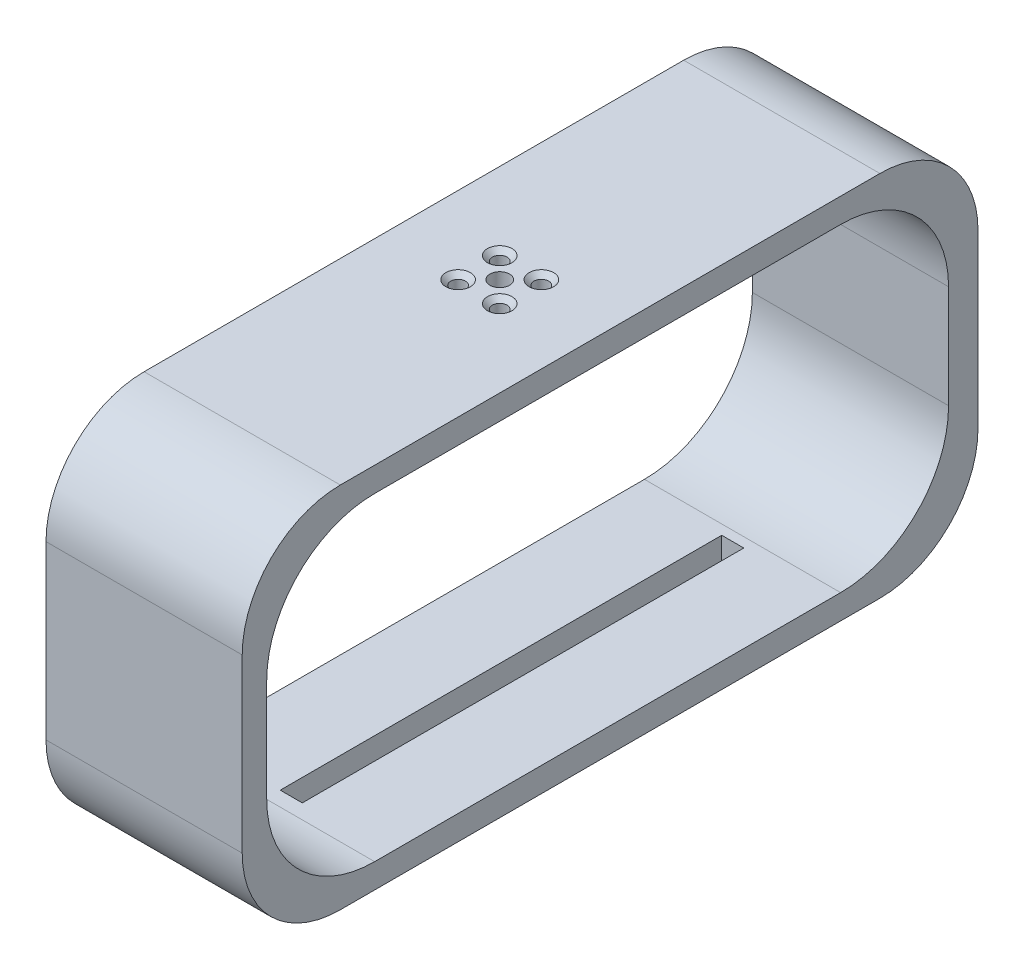
ISO-10303-21;
HEADER;
FILE_DESCRIPTION(('STEP AP214'),'2;1');
FILE_NAME('part.step','',(''),(''),'','','');
FILE_SCHEMA(('AUTOMOTIVE_DESIGN { 1 0 10303 214 1 1 1 1 }'));
ENDSEC;
DATA;
#1=APPLICATION_CONTEXT('core data for automotive mechanical design processes');
#2=APPLICATION_PROTOCOL_DEFINITION('international standard','automotive_design',2000,#1);
#3=PRODUCT_CONTEXT('',#1,'mechanical');
#4=PRODUCT('Part','Part','',(#3));
#5=PRODUCT_RELATED_PRODUCT_CATEGORY('part','',(#4));
#6=PRODUCT_DEFINITION_FORMATION('','',#4);
#7=PRODUCT_DEFINITION_CONTEXT('part definition',#1,'design');
#8=PRODUCT_DEFINITION('design','',#6,#7);
#9=PRODUCT_DEFINITION_SHAPE('','',#8);
#10=(LENGTH_UNIT() NAMED_UNIT(*) SI_UNIT(.MILLI.,.METRE.));
#11=(NAMED_UNIT(*) PLANE_ANGLE_UNIT() SI_UNIT($,.RADIAN.));
#12=(NAMED_UNIT(*) SI_UNIT($,.STERADIAN.) SOLID_ANGLE_UNIT());
#13=UNCERTAINTY_MEASURE_WITH_UNIT(LENGTH_MEASURE(1.E-05),#10,'distance_accuracy_value','');
#14=(GEOMETRIC_REPRESENTATION_CONTEXT(3) GLOBAL_UNCERTAINTY_ASSIGNED_CONTEXT((#13)) GLOBAL_UNIT_ASSIGNED_CONTEXT((#10,
#11,#12)) REPRESENTATION_CONTEXT('',''));
#15=CARTESIAN_POINT('',(0.,0.,0.));
#16=DIRECTION('',(0.,0.,1.));
#17=DIRECTION('',(1.,0.,0.));
#18=AXIS2_PLACEMENT_3D('',#15,#16,#17);
#19=CARTESIAN_POINT('',(20.,0.,0.));
#20=DIRECTION('',(1.,0.,0.));
#21=DIRECTION('',(0.,0.,-1.));
#22=AXIS2_PLACEMENT_3D('',#19,#20,#21);
#23=PLANE('',#22);
#24=DIRECTION('',(0.,-1.,0.));
#25=VECTOR('',#24,1.);
#26=CARTESIAN_POINT('',(20.,75.,0.));
#27=LINE('',#26,#25);
#28=CARTESIAN_POINT('',(20.,55.,0.));
#29=VERTEX_POINT('',#28);
#30=CARTESIAN_POINT('',(20.,20.,0.));
#31=VERTEX_POINT('',#30);
#32=EDGE_CURVE('E233',#29,#31,#27,.T.);
#33=ORIENTED_EDGE('',*,*,#32,.T.);
#34=CARTESIAN_POINT('',(20.,20.,-20.));
#35=DIRECTION('',(1.,0.,0.));
#36=DIRECTION('',(0.,0.,-1.));
#37=AXIS2_PLACEMENT_3D('',#34,#35,#36);
#38=CIRCLE('',#37,20.);
#39=CARTESIAN_POINT('',(20.,0.,-20.));
#40=VERTEX_POINT('',#39);
#41=EDGE_CURVE('E359',#31,#40,#38,.T.);
#42=ORIENTED_EDGE('',*,*,#41,.T.);
#43=DIRECTION('',(0.,0.,-1.));
#44=VECTOR('',#43,1.);
#45=CARTESIAN_POINT('',(20.,0.,0.));
#46=LINE('',#45,#44);
#47=CARTESIAN_POINT('',(20.,0.,-130.));
#48=VERTEX_POINT('',#47);
#49=EDGE_CURVE('E236',#40,#48,#46,.T.);
#50=ORIENTED_EDGE('',*,*,#49,.T.);
#51=CARTESIAN_POINT('',(20.,20.,-130.));
#52=DIRECTION('',(1.,0.,0.));
#53=DIRECTION('',(0.,0.,-1.));
#54=AXIS2_PLACEMENT_3D('',#51,#52,#53);
#55=CIRCLE('',#54,20.);
#56=CARTESIAN_POINT('',(20.,20.,-150.));
#57=VERTEX_POINT('',#56);
#58=EDGE_CURVE('E355',#48,#57,#55,.T.);
#59=ORIENTED_EDGE('',*,*,#58,.T.);
#60=DIRECTION('',(0.,1.,0.));
#61=VECTOR('',#60,1.);
#62=CARTESIAN_POINT('',(20.,0.,-150.));
#63=LINE('',#62,#61);
#64=CARTESIAN_POINT('',(20.,55.,-150.));
#65=VERTEX_POINT('',#64);
#66=EDGE_CURVE('E240',#57,#65,#63,.T.);
#67=ORIENTED_EDGE('',*,*,#66,.T.);
#68=CARTESIAN_POINT('',(20.,55.,-130.));
#69=DIRECTION('',(1.,0.,0.));
#70=DIRECTION('',(0.,0.,-1.));
#71=AXIS2_PLACEMENT_3D('',#68,#69,#70);
#72=CIRCLE('',#71,20.);
#73=CARTESIAN_POINT('',(20.,75.,-130.));
#74=VERTEX_POINT('',#73);
#75=EDGE_CURVE('E56',#65,#74,#72,.T.);
#76=ORIENTED_EDGE('',*,*,#75,.T.);
#77=DIRECTION('',(0.,0.,1.));
#78=VECTOR('',#77,1.);
#79=CARTESIAN_POINT('',(20.,75.,-150.));
#80=LINE('',#79,#78);
#81=CARTESIAN_POINT('',(20.,75.,-20.));
#82=VERTEX_POINT('',#81);
#83=EDGE_CURVE('E242',#74,#82,#80,.T.);
#84=ORIENTED_EDGE('',*,*,#83,.T.);
#85=CARTESIAN_POINT('',(20.,55.,-20.));
#86=DIRECTION('',(1.,0.,0.));
#87=DIRECTION('',(0.,0.,-1.));
#88=AXIS2_PLACEMENT_3D('',#85,#86,#87);
#89=CIRCLE('',#88,20.);
#90=EDGE_CURVE('E357',#82,#29,#89,.T.);
#91=ORIENTED_EDGE('',*,*,#90,.T.);
#92=EDGE_LOOP('',(#33,#42,#50,#59,#67,#76,#84,#91));
#93=FACE_BOUND('',#92,.T.);
#94=DIRECTION('',(0.,0.,-1.));
#95=VECTOR('',#94,1.);
#96=CARTESIAN_POINT('',(20.,5.,-144.));
#97=LINE('',#96,#95);
#98=CARTESIAN_POINT('',(20.,4.99999999999998,-27.));
#99=VERTEX_POINT('',#98);
#100=CARTESIAN_POINT('',(20.,4.99999999999999,-122.));
#101=VERTEX_POINT('',#100);
#102=EDGE_CURVE('E212',#99,#101,#97,.T.);
#103=ORIENTED_EDGE('',*,*,#102,.F.);
#104=CARTESIAN_POINT('',(20.,27.,-27.));
#105=DIRECTION('',(1.,0.,0.));
#106=DIRECTION('',(0.,0.,-1.));
#107=AXIS2_PLACEMENT_3D('',#104,#105,#106);
#108=CIRCLE('',#107,22.);
#109=CARTESIAN_POINT('',(20.,27.,-5.00000000000001));
#110=VERTEX_POINT('',#109);
#111=EDGE_CURVE('E330',#99,#110,#108,.F.);
#112=ORIENTED_EDGE('',*,*,#111,.T.);
#113=DIRECTION('',(0.,-1.,0.));
#114=VECTOR('',#113,1.);
#115=CARTESIAN_POINT('',(20.,4.99999999999998,-5.00000000000001));
#116=LINE('',#115,#114);
#117=CARTESIAN_POINT('',(20.,48.,-5.00000000000001));
#118=VERTEX_POINT('',#117);
#119=EDGE_CURVE('E209',#118,#110,#116,.T.);
#120=ORIENTED_EDGE('',*,*,#119,.F.);
#121=CARTESIAN_POINT('',(20.,48.,-27.));
#122=DIRECTION('',(1.,0.,0.));
#123=DIRECTION('',(0.,0.,-1.));
#124=AXIS2_PLACEMENT_3D('',#121,#122,#123);
#125=CIRCLE('',#124,22.);
#126=CARTESIAN_POINT('',(20.,70.,-27.));
#127=VERTEX_POINT('',#126);
#128=EDGE_CURVE('E334',#118,#127,#125,.F.);
#129=ORIENTED_EDGE('',*,*,#128,.T.);
#130=DIRECTION('',(0.,0.,1.));
#131=VECTOR('',#130,1.);
#132=CARTESIAN_POINT('',(20.,70.,-120.));
#133=LINE('',#132,#131);
#134=CARTESIAN_POINT('',(20.,70.,-122.));
#135=VERTEX_POINT('',#134);
#136=EDGE_CURVE('E219',#135,#127,#133,.T.);
#137=ORIENTED_EDGE('',*,*,#136,.F.);
#138=CARTESIAN_POINT('',(20.,48.,-122.));
#139=DIRECTION('',(1.,0.,0.));
#140=DIRECTION('',(0.,0.,-1.));
#141=AXIS2_PLACEMENT_3D('',#138,#139,#140);
#142=CIRCLE('',#141,22.);
#143=CARTESIAN_POINT('',(20.,48.,-144.));
#144=VERTEX_POINT('',#143);
#145=EDGE_CURVE('E326',#135,#144,#142,.F.);
#146=ORIENTED_EDGE('',*,*,#145,.T.);
#147=DIRECTION('',(0.,1.,0.));
#148=VECTOR('',#147,1.);
#149=CARTESIAN_POINT('',(20.,70.,-144.));
#150=LINE('',#149,#148);
#151=CARTESIAN_POINT('',(20.,27.,-144.));
#152=VERTEX_POINT('',#151);
#153=EDGE_CURVE('E216',#152,#144,#150,.T.);
#154=ORIENTED_EDGE('',*,*,#153,.F.);
#155=CARTESIAN_POINT('',(20.,27.,-122.));
#156=DIRECTION('',(1.,0.,0.));
#157=DIRECTION('',(0.,0.,-1.));
#158=AXIS2_PLACEMENT_3D('',#155,#156,#157);
#159=CIRCLE('',#158,22.);
#160=EDGE_CURVE('E322',#152,#101,#159,.F.);
#161=ORIENTED_EDGE('',*,*,#160,.T.);
#162=EDGE_LOOP('',(#103,#112,#120,#129,#137,#146,#154,#161));
#163=FACE_BOUND('',#162,.T.);
#164=ADVANCED_FACE('F34',(#93,#163),#23,.T.);
#165=CARTESIAN_POINT('',(-20.,0.,0.));
#166=DIRECTION('',(1.,0.,0.));
#167=DIRECTION('',(0.,0.,-1.));
#168=AXIS2_PLACEMENT_3D('',#165,#166,#167);
#169=PLANE('',#168);
#170=DIRECTION('',(0.,0.,-1.));
#171=VECTOR('',#170,1.);
#172=CARTESIAN_POINT('',(-20.,0.,0.));
#173=LINE('',#172,#171);
#174=CARTESIAN_POINT('',(-20.,0.,-20.));
#175=VERTEX_POINT('',#174);
#176=CARTESIAN_POINT('',(-20.,0.,-130.));
#177=VERTEX_POINT('',#176);
#178=EDGE_CURVE('E247',#175,#177,#173,.T.);
#179=ORIENTED_EDGE('',*,*,#178,.F.);
#180=CARTESIAN_POINT('',(-20.,20.,-20.));
#181=DIRECTION('',(1.,0.,0.));
#182=DIRECTION('',(0.,0.,-1.));
#183=AXIS2_PLACEMENT_3D('',#180,#181,#182);
#184=CIRCLE('',#183,20.);
#185=CARTESIAN_POINT('',(-20.,20.,0.));
#186=VERTEX_POINT('',#185);
#187=EDGE_CURVE('E347',#175,#186,#184,.F.);
#188=ORIENTED_EDGE('',*,*,#187,.T.);
#189=DIRECTION('',(0.,-1.,0.));
#190=VECTOR('',#189,1.);
#191=CARTESIAN_POINT('',(-20.,75.,0.));
#192=LINE('',#191,#190);
#193=CARTESIAN_POINT('',(-20.,55.,0.));
#194=VERTEX_POINT('',#193);
#195=EDGE_CURVE('E222',#194,#186,#192,.T.);
#196=ORIENTED_EDGE('',*,*,#195,.F.);
#197=CARTESIAN_POINT('',(-20.,55.,-20.));
#198=DIRECTION('',(1.,0.,0.));
#199=DIRECTION('',(0.,0.,-1.));
#200=AXIS2_PLACEMENT_3D('',#197,#198,#199);
#201=CIRCLE('',#200,20.);
#202=CARTESIAN_POINT('',(-20.,75.,-20.));
#203=VERTEX_POINT('',#202);
#204=EDGE_CURVE('E345',#194,#203,#201,.F.);
#205=ORIENTED_EDGE('',*,*,#204,.T.);
#206=DIRECTION('',(0.,0.,1.));
#207=VECTOR('',#206,1.);
#208=CARTESIAN_POINT('',(-20.,75.,-120.));
#209=LINE('',#208,#207);
#210=CARTESIAN_POINT('',(-20.,75.,-130.));
#211=VERTEX_POINT('',#210);
#212=EDGE_CURVE('E237',#211,#203,#209,.T.);
#213=ORIENTED_EDGE('',*,*,#212,.F.);
#214=CARTESIAN_POINT('',(-20.,55.,-130.));
#215=DIRECTION('',(1.,0.,0.));
#216=DIRECTION('',(0.,0.,-1.));
#217=AXIS2_PLACEMENT_3D('',#214,#215,#216);
#218=CIRCLE('',#217,20.);
#219=CARTESIAN_POINT('',(-20.,55.,-150.));
#220=VERTEX_POINT('',#219);
#221=EDGE_CURVE('E341',#211,#220,#218,.F.);
#222=ORIENTED_EDGE('',*,*,#221,.T.);
#223=DIRECTION('',(0.,1.,0.));
#224=VECTOR('',#223,1.);
#225=CARTESIAN_POINT('',(-20.,3.00000000000002,-150.));
#226=LINE('',#225,#224);
#227=CARTESIAN_POINT('',(-20.,20.,-150.));
#228=VERTEX_POINT('',#227);
#229=EDGE_CURVE('E250',#228,#220,#226,.T.);
#230=ORIENTED_EDGE('',*,*,#229,.F.);
#231=CARTESIAN_POINT('',(-20.,20.,-130.));
#232=DIRECTION('',(1.,0.,0.));
#233=DIRECTION('',(0.,0.,-1.));
#234=AXIS2_PLACEMENT_3D('',#231,#232,#233);
#235=CIRCLE('',#234,20.);
#236=EDGE_CURVE('E343',#228,#177,#235,.F.);
#237=ORIENTED_EDGE('',*,*,#236,.T.);
#238=EDGE_LOOP('',(#179,#188,#196,#205,#213,#222,#230,#237));
#239=FACE_BOUND('',#238,.T.);
#240=DIRECTION('',(0.,0.,1.));
#241=VECTOR('',#240,1.);
#242=CARTESIAN_POINT('',(-20.,70.,-5.00000000000001));
#243=LINE('',#242,#241);
#244=CARTESIAN_POINT('',(-20.,70.,-122.));
#245=VERTEX_POINT('',#244);
#246=CARTESIAN_POINT('',(-20.,70.,-27.));
#247=VERTEX_POINT('',#246);
#248=EDGE_CURVE('E213',#245,#247,#243,.T.);
#249=ORIENTED_EDGE('',*,*,#248,.T.);
#250=CARTESIAN_POINT('',(-20.,48.,-27.));
#251=DIRECTION('',(1.,0.,0.));
#252=DIRECTION('',(0.,0.,-1.));
#253=AXIS2_PLACEMENT_3D('',#250,#251,#252);
#254=CIRCLE('',#253,22.);
#255=CARTESIAN_POINT('',(-20.,48.,-5.00000000000001));
#256=VERTEX_POINT('',#255);
#257=EDGE_CURVE('E332',#247,#256,#254,.T.);
#258=ORIENTED_EDGE('',*,*,#257,.T.);
#259=DIRECTION('',(0.,-1.,0.));
#260=VECTOR('',#259,1.);
#261=CARTESIAN_POINT('',(-20.,4.99999999999998,-5.00000000000001));
#262=LINE('',#261,#260);
#263=CARTESIAN_POINT('',(-20.,27.,-5.00000000000001));
#264=VERTEX_POINT('',#263);
#265=EDGE_CURVE('E206',#256,#264,#262,.T.);
#266=ORIENTED_EDGE('',*,*,#265,.T.);
#267=CARTESIAN_POINT('',(-20.,27.,-27.));
#268=DIRECTION('',(1.,0.,0.));
#269=DIRECTION('',(0.,0.,-1.));
#270=AXIS2_PLACEMENT_3D('',#267,#268,#269);
#271=CIRCLE('',#270,22.);
#272=CARTESIAN_POINT('',(-20.,4.99999999999998,-27.));
#273=VERTEX_POINT('',#272);
#274=EDGE_CURVE('E328',#264,#273,#271,.T.);
#275=ORIENTED_EDGE('',*,*,#274,.T.);
#276=DIRECTION('',(0.,0.,-1.));
#277=VECTOR('',#276,1.);
#278=CARTESIAN_POINT('',(-20.,5.,-144.));
#279=LINE('',#278,#277);
#280=CARTESIAN_POINT('',(-20.,4.99999999999999,-122.));
#281=VERTEX_POINT('',#280);
#282=EDGE_CURVE('E225',#273,#281,#279,.T.);
#283=ORIENTED_EDGE('',*,*,#282,.T.);
#284=CARTESIAN_POINT('',(-20.,27.,-122.));
#285=DIRECTION('',(1.,0.,0.));
#286=DIRECTION('',(0.,0.,-1.));
#287=AXIS2_PLACEMENT_3D('',#284,#285,#286);
#288=CIRCLE('',#287,22.);
#289=CARTESIAN_POINT('',(-20.,27.,-144.));
#290=VERTEX_POINT('',#289);
#291=EDGE_CURVE('E320',#281,#290,#288,.T.);
#292=ORIENTED_EDGE('',*,*,#291,.T.);
#293=DIRECTION('',(0.,1.,0.));
#294=VECTOR('',#293,1.);
#295=CARTESIAN_POINT('',(-20.,70.,-144.));
#296=LINE('',#295,#294);
#297=CARTESIAN_POINT('',(-20.,48.,-144.));
#298=VERTEX_POINT('',#297);
#299=EDGE_CURVE('E228',#290,#298,#296,.T.);
#300=ORIENTED_EDGE('',*,*,#299,.T.);
#301=CARTESIAN_POINT('',(-20.,48.,-122.));
#302=DIRECTION('',(1.,0.,0.));
#303=DIRECTION('',(0.,0.,-1.));
#304=AXIS2_PLACEMENT_3D('',#301,#302,#303);
#305=CIRCLE('',#304,22.);
#306=EDGE_CURVE('E324',#298,#245,#305,.T.);
#307=ORIENTED_EDGE('',*,*,#306,.T.);
#308=EDGE_LOOP('',(#249,#258,#266,#275,#283,#292,#300,#307));
#309=FACE_BOUND('',#308,.T.);
#310=ADVANCED_FACE('F378',(#239,#309),#169,.F.);
#311=CARTESIAN_POINT('',(20.,75.,0.));
#312=DIRECTION('',(0.,0.,-1.));
#313=DIRECTION('',(-1.,0.,0.));
#314=AXIS2_PLACEMENT_3D('',#311,#312,#313);
#315=PLANE('',#314);
#316=ORIENTED_EDGE('',*,*,#195,.T.);
#317=DIRECTION('',(-1.,0.,0.));
#318=VECTOR('',#317,1.);
#319=CARTESIAN_POINT('',(20.,20.,0.));
#320=LINE('',#319,#318);
#321=EDGE_CURVE('E352',#186,#31,#320,.F.);
#322=ORIENTED_EDGE('',*,*,#321,.T.);
#323=ORIENTED_EDGE('',*,*,#32,.F.);
#324=DIRECTION('',(-1.,0.,0.));
#325=VECTOR('',#324,1.);
#326=CARTESIAN_POINT('',(20.,55.,0.));
#327=LINE('',#326,#325);
#328=EDGE_CURVE('E349',#29,#194,#327,.T.);
#329=ORIENTED_EDGE('',*,*,#328,.T.);
#330=EDGE_LOOP('',(#316,#322,#323,#329));
#331=FACE_BOUND('',#330,.T.);
#332=ADVANCED_FACE('F387',(#331),#315,.F.);
#333=CARTESIAN_POINT('',(20.,0.,0.));
#334=DIRECTION('',(0.,1.,0.));
#335=DIRECTION('',(0.,0.,1.));
#336=AXIS2_PLACEMENT_3D('',#333,#334,#335);
#337=PLANE('',#336);
#338=DIRECTION('',(0.,0.,-1.));
#339=VECTOR('',#338,1.);
#340=CARTESIAN_POINT('',(-2.25,0.,-120.));
#341=LINE('',#340,#339);
#342=CARTESIAN_POINT('',(-2.25,0.,-30.));
#343=VERTEX_POINT('',#342);
#344=CARTESIAN_POINT('',(-2.25,0.,-120.));
#345=VERTEX_POINT('',#344);
#346=EDGE_CURVE('E189',#343,#345,#341,.T.);
#347=ORIENTED_EDGE('',*,*,#346,.F.);
#348=DIRECTION('',(-1.,0.,0.));
#349=VECTOR('',#348,1.);
#350=CARTESIAN_POINT('',(-2.25,0.,-30.));
#351=LINE('',#350,#349);
#352=CARTESIAN_POINT('',(2.25,0.,-30.));
#353=VERTEX_POINT('',#352);
#354=EDGE_CURVE('E194',#353,#343,#351,.T.);
#355=ORIENTED_EDGE('',*,*,#354,.F.);
#356=DIRECTION('',(0.,0.,1.));
#357=VECTOR('',#356,1.);
#358=CARTESIAN_POINT('',(2.25,0.,-30.));
#359=LINE('',#358,#357);
#360=CARTESIAN_POINT('',(2.25000000000001,0.,-120.));
#361=VERTEX_POINT('',#360);
#362=EDGE_CURVE('E199',#361,#353,#359,.T.);
#363=ORIENTED_EDGE('',*,*,#362,.F.);
#364=DIRECTION('',(1.,0.,0.));
#365=VECTOR('',#364,1.);
#366=CARTESIAN_POINT('',(2.25000000000001,0.,-120.));
#367=LINE('',#366,#365);
#368=EDGE_CURVE('E178',#345,#361,#367,.T.);
#369=ORIENTED_EDGE('',*,*,#368,.F.);
#370=EDGE_LOOP('',(#347,#355,#363,#369));
#371=FACE_BOUND('',#370,.T.);
#372=ORIENTED_EDGE('',*,*,#49,.F.);
#373=DIRECTION('',(-1.,0.,0.));
#374=VECTOR('',#373,1.);
#375=CARTESIAN_POINT('',(20.,0.,-20.));
#376=LINE('',#375,#374);
#377=EDGE_CURVE('E338',#40,#175,#376,.T.);
#378=ORIENTED_EDGE('',*,*,#377,.T.);
#379=ORIENTED_EDGE('',*,*,#178,.T.);
#380=DIRECTION('',(-1.,0.,0.));
#381=VECTOR('',#380,1.);
#382=CARTESIAN_POINT('',(20.,0.,-130.));
#383=LINE('',#382,#381);
#384=EDGE_CURVE('E336',#177,#48,#383,.F.);
#385=ORIENTED_EDGE('',*,*,#384,.T.);
#386=EDGE_LOOP('',(#372,#378,#379,#385));
#387=FACE_BOUND('',#386,.T.);
#388=ADVANCED_FACE('F196',(#371,#387),#337,.F.);
#389=CARTESIAN_POINT('',(20.,3.00000000000002,-150.));
#390=DIRECTION('',(0.,0.,1.));
#391=DIRECTION('',(1.,0.,0.));
#392=AXIS2_PLACEMENT_3D('',#389,#390,#391);
#393=PLANE('',#392);
#394=ORIENTED_EDGE('',*,*,#66,.F.);
#395=DIRECTION('',(-1.,0.,0.));
#396=VECTOR('',#395,1.);
#397=CARTESIAN_POINT('',(20.,20.,-150.));
#398=LINE('',#397,#396);
#399=EDGE_CURVE('E11',#57,#228,#398,.T.);
#400=ORIENTED_EDGE('',*,*,#399,.T.);
#401=ORIENTED_EDGE('',*,*,#229,.T.);
#402=DIRECTION('',(-1.,0.,0.));
#403=VECTOR('',#402,1.);
#404=CARTESIAN_POINT('',(20.,55.,-150.));
#405=LINE('',#404,#403);
#406=EDGE_CURVE('E42',#220,#65,#405,.F.);
#407=ORIENTED_EDGE('',*,*,#406,.T.);
#408=EDGE_LOOP('',(#394,#400,#401,#407));
#409=FACE_BOUND('',#408,.T.);
#410=ADVANCED_FACE('F367',(#409),#393,.F.);
#411=CARTESIAN_POINT('',(20.,75.,-120.));
#412=DIRECTION('',(0.,-1.,0.));
#413=DIRECTION('',(0.,0.,-1.));
#414=AXIS2_PLACEMENT_3D('',#411,#412,#413);
#415=PLANE('',#414);
#416=CARTESIAN_POINT('',(4.24264068711923,75.,-68.2573593128807));
#417=DIRECTION('',(0.,-1.,0.));
#418=DIRECTION('',(0.,0.,-1.));
#419=AXIS2_PLACEMENT_3D('',#416,#417,#418);
#420=CIRCLE('',#419,2.5);
#421=CARTESIAN_POINT('',(4.24264068711923,75.,-70.7573593128807));
#422=VERTEX_POINT('',#421);
#423=EDGE_CURVE('E288',#422,#422,#420,.T.);
#424=ORIENTED_EDGE('',*,*,#423,.T.);
#425=EDGE_LOOP('',(#424));
#426=FACE_BOUND('',#425,.T.);
#427=CARTESIAN_POINT('',(4.24264068711929,75.,-76.7426406871193));
#428=DIRECTION('',(0.,-1.,0.));
#429=DIRECTION('',(0.,0.,-1.));
#430=AXIS2_PLACEMENT_3D('',#427,#428,#429);
#431=CIRCLE('',#430,2.50000000000002);
#432=CARTESIAN_POINT('',(4.24264068711929,75.,-79.2426406871193));
#433=VERTEX_POINT('',#432);
#434=EDGE_CURVE('E285',#433,#433,#431,.T.);
#435=ORIENTED_EDGE('',*,*,#434,.T.);
#436=EDGE_LOOP('',(#435));
#437=FACE_BOUND('',#436,.T.);
#438=CARTESIAN_POINT('',(-4.24264068711935,75.,-76.7426406871193));
#439=DIRECTION('',(0.,-1.,0.));
#440=DIRECTION('',(0.,0.,-1.));
#441=AXIS2_PLACEMENT_3D('',#438,#439,#440);
#442=CIRCLE('',#441,2.49999999999995);
#443=CARTESIAN_POINT('',(-4.24264068711935,75.,-79.2426406871192));
#444=VERTEX_POINT('',#443);
#445=EDGE_CURVE('E282',#444,#444,#442,.T.);
#446=ORIENTED_EDGE('',*,*,#445,.T.);
#447=EDGE_LOOP('',(#446));
#448=FACE_BOUND('',#447,.T.);
#449=CARTESIAN_POINT('',(-4.24264068711935,75.,-68.2573593128807));
#450=DIRECTION('',(0.,-1.,0.));
#451=DIRECTION('',(0.,0.,-1.));
#452=AXIS2_PLACEMENT_3D('',#449,#450,#451);
#453=CIRCLE('',#452,2.50000000000015);
#454=CARTESIAN_POINT('',(-4.24264068711935,75.,-70.7573593128809));
#455=VERTEX_POINT('',#454);
#456=EDGE_CURVE('E279',#455,#455,#453,.T.);
#457=ORIENTED_EDGE('',*,*,#456,.T.);
#458=EDGE_LOOP('',(#457));
#459=FACE_BOUND('',#458,.T.);
#460=CARTESIAN_POINT('',(0.,75.,-72.5));
#461=DIRECTION('',(0.,1.,0.));
#462=DIRECTION('',(0.,0.,1.));
#463=AXIS2_PLACEMENT_3D('',#460,#461,#462);
#464=CIRCLE('',#463,2.);
#465=CARTESIAN_POINT('',(0.,75.,-70.5));
#466=VERTEX_POINT('',#465);
#467=EDGE_CURVE('E276',#466,#466,#464,.T.);
#468=ORIENTED_EDGE('',*,*,#467,.F.);
#469=EDGE_LOOP('',(#468));
#470=FACE_BOUND('',#469,.T.);
#471=ORIENTED_EDGE('',*,*,#212,.T.);
#472=DIRECTION('',(-1.,0.,0.));
#473=VECTOR('',#472,1.);
#474=CARTESIAN_POINT('',(20.,75.,-20.));
#475=LINE('',#474,#473);
#476=EDGE_CURVE('E49',#203,#82,#475,.F.);
#477=ORIENTED_EDGE('',*,*,#476,.T.);
#478=ORIENTED_EDGE('',*,*,#83,.F.);
#479=DIRECTION('',(-1.,0.,0.));
#480=VECTOR('',#479,1.);
#481=CARTESIAN_POINT('',(20.,75.,-130.));
#482=LINE('',#481,#480);
#483=EDGE_CURVE('E361',#74,#211,#482,.T.);
#484=ORIENTED_EDGE('',*,*,#483,.T.);
#485=EDGE_LOOP('',(#471,#477,#478,#484));
#486=FACE_BOUND('',#485,.T.);
#487=ADVANCED_FACE('F375',(#426,#437,#448,#459,#470,#486),#415,.F.);
#488=CARTESIAN_POINT('',(20.,4.99999999999998,-5.00000000000001));
#489=DIRECTION('',(0.,0.,-1.));
#490=DIRECTION('',(0.,1.,0.));
#491=AXIS2_PLACEMENT_3D('',#488,#489,#490);
#492=PLANE('',#491);
#493=ORIENTED_EDGE('',*,*,#119,.T.);
#494=DIRECTION('',(-1.,0.,0.));
#495=VECTOR('',#494,1.);
#496=CARTESIAN_POINT('',(-20.,27.,-5.00000000000001));
#497=LINE('',#496,#495);
#498=EDGE_CURVE('E317',#110,#264,#497,.T.);
#499=ORIENTED_EDGE('',*,*,#498,.T.);
#500=ORIENTED_EDGE('',*,*,#265,.F.);
#501=DIRECTION('',(-1.,0.,0.));
#502=VECTOR('',#501,1.);
#503=CARTESIAN_POINT('',(20.,48.,-5.00000000000001));
#504=LINE('',#503,#502);
#505=EDGE_CURVE('E315',#256,#118,#504,.F.);
#506=ORIENTED_EDGE('',*,*,#505,.T.);
#507=EDGE_LOOP('',(#493,#499,#500,#506));
#508=FACE_BOUND('',#507,.T.);
#509=ADVANCED_FACE('F410',(#508),#492,.T.);
#510=CARTESIAN_POINT('',(20.,5.,-144.));
#511=DIRECTION('',(0.,1.,0.));
#512=DIRECTION('',(0.,0.,1.));
#513=AXIS2_PLACEMENT_3D('',#510,#511,#512);
#514=PLANE('',#513);
#515=DIRECTION('',(1.,0.,0.));
#516=VECTOR('',#515,1.);
#517=CARTESIAN_POINT('',(20.,4.99999999999998,-30.));
#518=LINE('',#517,#516);
#519=CARTESIAN_POINT('',(-2.25,4.99999999999999,-30.));
#520=VERTEX_POINT('',#519);
#521=CARTESIAN_POINT('',(2.25,4.99999999999999,-30.));
#522=VERTEX_POINT('',#521);
#523=EDGE_CURVE('E258',#520,#522,#518,.T.);
#524=ORIENTED_EDGE('',*,*,#523,.F.);
#525=DIRECTION('',(0.,0.,1.));
#526=VECTOR('',#525,1.);
#527=CARTESIAN_POINT('',(-2.25,5.,-144.));
#528=LINE('',#527,#526);
#529=CARTESIAN_POINT('',(-2.25,4.99999999999999,-120.));
#530=VERTEX_POINT('',#529);
#531=EDGE_CURVE('E244',#530,#520,#528,.T.);
#532=ORIENTED_EDGE('',*,*,#531,.F.);
#533=DIRECTION('',(-1.,0.,0.));
#534=VECTOR('',#533,1.);
#535=CARTESIAN_POINT('',(20.,4.99999999999999,-120.));
#536=LINE('',#535,#534);
#537=CARTESIAN_POINT('',(2.25000000000001,4.99999999999999,-120.));
#538=VERTEX_POINT('',#537);
#539=EDGE_CURVE('E181',#538,#530,#536,.T.);
#540=ORIENTED_EDGE('',*,*,#539,.F.);
#541=DIRECTION('',(0.,0.,-1.));
#542=VECTOR('',#541,1.);
#543=CARTESIAN_POINT('',(2.25000000000002,5.,-144.));
#544=LINE('',#543,#542);
#545=EDGE_CURVE('E256',#522,#538,#544,.T.);
#546=ORIENTED_EDGE('',*,*,#545,.F.);
#547=EDGE_LOOP('',(#524,#532,#540,#546));
#548=FACE_BOUND('',#547,.T.);
#549=ORIENTED_EDGE('',*,*,#102,.T.);
#550=DIRECTION('',(-1.,0.,0.));
#551=VECTOR('',#550,1.);
#552=CARTESIAN_POINT('',(-20.,4.99999999999999,-122.));
#553=LINE('',#552,#551);
#554=EDGE_CURVE('E302',#101,#281,#553,.T.);
#555=ORIENTED_EDGE('',*,*,#554,.T.);
#556=ORIENTED_EDGE('',*,*,#282,.F.);
#557=DIRECTION('',(-1.,0.,0.));
#558=VECTOR('',#557,1.);
#559=CARTESIAN_POINT('',(20.,4.99999999999998,-27.));
#560=LINE('',#559,#558);
#561=EDGE_CURVE('E300',#273,#99,#560,.F.);
#562=ORIENTED_EDGE('',*,*,#561,.T.);
#563=EDGE_LOOP('',(#549,#555,#556,#562));
#564=FACE_BOUND('',#563,.T.);
#565=ADVANCED_FACE('F616',(#548,#564),#514,.T.);
#566=CARTESIAN_POINT('',(20.,70.,-144.));
#567=DIRECTION('',(0.,0.,1.));
#568=DIRECTION('',(1.,0.,0.));
#569=AXIS2_PLACEMENT_3D('',#566,#567,#568);
#570=PLANE('',#569);
#571=ORIENTED_EDGE('',*,*,#299,.F.);
#572=DIRECTION('',(-1.,0.,0.));
#573=VECTOR('',#572,1.);
#574=CARTESIAN_POINT('',(20.,27.,-144.));
#575=LINE('',#574,#573);
#576=EDGE_CURVE('E308',#290,#152,#575,.F.);
#577=ORIENTED_EDGE('',*,*,#576,.T.);
#578=ORIENTED_EDGE('',*,*,#153,.T.);
#579=DIRECTION('',(-1.,0.,0.));
#580=VECTOR('',#579,1.);
#581=CARTESIAN_POINT('',(-20.,48.,-144.));
#582=LINE('',#581,#580);
#583=EDGE_CURVE('E305',#144,#298,#582,.T.);
#584=ORIENTED_EDGE('',*,*,#583,.T.);
#585=EDGE_LOOP('',(#571,#577,#578,#584));
#586=FACE_BOUND('',#585,.T.);
#587=ADVANCED_FACE('F604',(#586),#570,.T.);
#588=CARTESIAN_POINT('',(20.,70.,-5.00000000000001));
#589=DIRECTION('',(0.,-1.,0.));
#590=DIRECTION('',(0.,0.,-1.));
#591=AXIS2_PLACEMENT_3D('',#588,#589,#590);
#592=PLANE('',#591);
#593=CARTESIAN_POINT('',(0.,70.,-72.5));
#594=DIRECTION('',(0.,-1.,0.));
#595=DIRECTION('',(0.,0.,-1.));
#596=AXIS2_PLACEMENT_3D('',#593,#594,#595);
#597=CIRCLE('',#596,2.);
#598=CARTESIAN_POINT('',(0.,70.,-74.5));
#599=VERTEX_POINT('',#598);
#600=EDGE_CURVE('E273',#599,#599,#597,.T.);
#601=ORIENTED_EDGE('',*,*,#600,.F.);
#602=EDGE_LOOP('',(#601));
#603=FACE_BOUND('',#602,.T.);
#604=CARTESIAN_POINT('',(-4.24264068711935,70.,-68.2573593128807));
#605=DIRECTION('',(0.,-1.,0.));
#606=DIRECTION('',(0.,0.,-1.));
#607=AXIS2_PLACEMENT_3D('',#604,#605,#606);
#608=CIRCLE('',#607,1.50000000000019);
#609=CARTESIAN_POINT('',(-4.24264068711935,70.,-69.7573593128809));
#610=VERTEX_POINT('',#609);
#611=EDGE_CURVE('E270',#610,#610,#608,.T.);
#612=ORIENTED_EDGE('',*,*,#611,.F.);
#613=EDGE_LOOP('',(#612));
#614=FACE_BOUND('',#613,.T.);
#615=CARTESIAN_POINT('',(4.24264068711923,70.,-68.2573593128807));
#616=DIRECTION('',(0.,-1.,0.));
#617=DIRECTION('',(0.,0.,-1.));
#618=AXIS2_PLACEMENT_3D('',#615,#616,#617);
#619=CIRCLE('',#618,1.5);
#620=CARTESIAN_POINT('',(4.24264068711923,70.,-69.7573593128807));
#621=VERTEX_POINT('',#620);
#622=EDGE_CURVE('E267',#621,#621,#619,.T.);
#623=ORIENTED_EDGE('',*,*,#622,.F.);
#624=EDGE_LOOP('',(#623));
#625=FACE_BOUND('',#624,.T.);
#626=CARTESIAN_POINT('',(4.24264068711929,70.,-76.7426406871193));
#627=DIRECTION('',(0.,-1.,0.));
#628=DIRECTION('',(0.,0.,-1.));
#629=AXIS2_PLACEMENT_3D('',#626,#627,#628);
#630=CIRCLE('',#629,1.50000000000007);
#631=CARTESIAN_POINT('',(4.24264068711929,70.,-78.2426406871194));
#632=VERTEX_POINT('',#631);
#633=EDGE_CURVE('E264',#632,#632,#630,.T.);
#634=ORIENTED_EDGE('',*,*,#633,.F.);
#635=EDGE_LOOP('',(#634));
#636=FACE_BOUND('',#635,.T.);
#637=CARTESIAN_POINT('',(-4.24264068711935,70.,-76.7426406871193));
#638=DIRECTION('',(0.,-1.,0.));
#639=DIRECTION('',(0.,0.,-1.));
#640=AXIS2_PLACEMENT_3D('',#637,#638,#639);
#641=CIRCLE('',#640,1.49999999999999);
#642=CARTESIAN_POINT('',(-4.24264068711935,70.,-78.2426406871193));
#643=VERTEX_POINT('',#642);
#644=EDGE_CURVE('E261',#643,#643,#641,.T.);
#645=ORIENTED_EDGE('',*,*,#644,.F.);
#646=EDGE_LOOP('',(#645));
#647=FACE_BOUND('',#646,.T.);
#648=ORIENTED_EDGE('',*,*,#248,.F.);
#649=DIRECTION('',(-1.,0.,0.));
#650=VECTOR('',#649,1.);
#651=CARTESIAN_POINT('',(20.,70.,-122.));
#652=LINE('',#651,#650);
#653=EDGE_CURVE('E313',#245,#135,#652,.F.);
#654=ORIENTED_EDGE('',*,*,#653,.T.);
#655=ORIENTED_EDGE('',*,*,#136,.T.);
#656=DIRECTION('',(-1.,0.,0.));
#657=VECTOR('',#656,1.);
#658=CARTESIAN_POINT('',(-20.,70.,-27.));
#659=LINE('',#658,#657);
#660=EDGE_CURVE('E310',#127,#247,#659,.T.);
#661=ORIENTED_EDGE('',*,*,#660,.T.);
#662=EDGE_LOOP('',(#648,#654,#655,#661));
#663=FACE_BOUND('',#662,.T.);
#664=ADVANCED_FACE('F596',(#603,#614,#625,#636,#647,#663),#592,.T.);
#665=CARTESIAN_POINT('',(-2.25,10.,-30.));
#666=DIRECTION('',(0.,0.,1.));
#667=DIRECTION('',(1.,0.,0.));
#668=AXIS2_PLACEMENT_3D('',#665,#666,#667);
#669=PLANE('',#668);
#670=ORIENTED_EDGE('',*,*,#523,.T.);
#671=DIRECTION('',(0.,-1.,0.));
#672=VECTOR('',#671,1.);
#673=CARTESIAN_POINT('',(2.25,10.,-30.));
#674=LINE('',#673,#672);
#675=EDGE_CURVE('E204',#522,#353,#674,.T.);
#676=ORIENTED_EDGE('',*,*,#675,.T.);
#677=ORIENTED_EDGE('',*,*,#354,.T.);
#678=DIRECTION('',(0.,-1.,0.));
#679=VECTOR('',#678,1.);
#680=CARTESIAN_POINT('',(-2.25,10.,-30.));
#681=LINE('',#680,#679);
#682=EDGE_CURVE('E185',#520,#343,#681,.T.);
#683=ORIENTED_EDGE('',*,*,#682,.F.);
#684=EDGE_LOOP('',(#670,#676,#677,#683));
#685=FACE_BOUND('',#684,.T.);
#686=ADVANCED_FACE('F587',(#685),#669,.F.);
#687=CARTESIAN_POINT('',(2.25,10.,-30.));
#688=DIRECTION('',(1.,0.,0.));
#689=DIRECTION('',(0.,0.,-1.));
#690=AXIS2_PLACEMENT_3D('',#687,#688,#689);
#691=PLANE('',#690);
#692=ORIENTED_EDGE('',*,*,#545,.T.);
#693=DIRECTION('',(0.,-1.,0.));
#694=VECTOR('',#693,1.);
#695=CARTESIAN_POINT('',(2.25000000000001,10.,-120.));
#696=LINE('',#695,#694);
#697=EDGE_CURVE('E184',#538,#361,#696,.T.);
#698=ORIENTED_EDGE('',*,*,#697,.T.);
#699=ORIENTED_EDGE('',*,*,#362,.T.);
#700=ORIENTED_EDGE('',*,*,#675,.F.);
#701=EDGE_LOOP('',(#692,#698,#699,#700));
#702=FACE_BOUND('',#701,.T.);
#703=ADVANCED_FACE('F579',(#702),#691,.F.);
#704=CARTESIAN_POINT('',(2.25000000000001,10.,-120.));
#705=DIRECTION('',(0.,0.,-1.));
#706=DIRECTION('',(-1.,0.,0.));
#707=AXIS2_PLACEMENT_3D('',#704,#705,#706);
#708=PLANE('',#707);
#709=ORIENTED_EDGE('',*,*,#539,.T.);
#710=DIRECTION('',(0.,-1.,0.));
#711=VECTOR('',#710,1.);
#712=CARTESIAN_POINT('',(-2.25,10.,-120.));
#713=LINE('',#712,#711);
#714=EDGE_CURVE('E173',#530,#345,#713,.T.);
#715=ORIENTED_EDGE('',*,*,#714,.T.);
#716=ORIENTED_EDGE('',*,*,#368,.T.);
#717=ORIENTED_EDGE('',*,*,#697,.F.);
#718=EDGE_LOOP('',(#709,#715,#716,#717));
#719=FACE_BOUND('',#718,.T.);
#720=ADVANCED_FACE('F175',(#719),#708,.F.);
#721=CARTESIAN_POINT('',(-2.25,10.,-120.));
#722=DIRECTION('',(-1.,0.,0.));
#723=DIRECTION('',(0.,0.,1.));
#724=AXIS2_PLACEMENT_3D('',#721,#722,#723);
#725=PLANE('',#724);
#726=ORIENTED_EDGE('',*,*,#531,.T.);
#727=ORIENTED_EDGE('',*,*,#682,.T.);
#728=ORIENTED_EDGE('',*,*,#346,.T.);
#729=ORIENTED_EDGE('',*,*,#714,.F.);
#730=EDGE_LOOP('',(#726,#727,#728,#729));
#731=FACE_BOUND('',#730,.T.);
#732=ADVANCED_FACE('F190',(#731),#725,.F.);
#733=CARTESIAN_POINT('',(-4.24264068711935,65.,-76.7426406871193));
#734=DIRECTION('',(0.,1.,0.));
#735=DIRECTION('',(0.,0.,1.));
#736=AXIS2_PLACEMENT_3D('',#733,#734,#735);
#737=CYLINDRICAL_SURFACE('',#736,1.49999999999999);
#738=CARTESIAN_POINT('',(-4.24264068711935,74.,-76.7426406871193));
#739=DIRECTION('',(0.,-1.,0.));
#740=DIRECTION('',(0.,0.,-1.));
#741=AXIS2_PLACEMENT_3D('',#738,#739,#740);
#742=CIRCLE('',#741,1.49999999999999);
#743=CARTESIAN_POINT('',(-4.24264068711935,74.,-78.2426406871193));
#744=VERTEX_POINT('',#743);
#745=EDGE_CURVE('E294',#744,#744,#742,.F.);
#746=ORIENTED_EDGE('',*,*,#745,.T.);
#747=EDGE_LOOP('',(#746));
#748=FACE_BOUND('',#747,.T.);
#749=ORIENTED_EDGE('',*,*,#644,.T.);
#750=EDGE_LOOP('',(#749));
#751=FACE_BOUND('',#750,.T.);
#752=ADVANCED_FACE('F557',(#748,#751),#737,.F.);
#753=CARTESIAN_POINT('',(4.24264068711929,65.,-76.7426406871193));
#754=DIRECTION('',(0.,1.,0.));
#755=DIRECTION('',(0.,0.,1.));
#756=AXIS2_PLACEMENT_3D('',#753,#754,#755);
#757=CYLINDRICAL_SURFACE('',#756,1.50000000000007);
#758=CARTESIAN_POINT('',(4.24264068711929,74.,-76.7426406871193));
#759=DIRECTION('',(0.,-1.,0.));
#760=DIRECTION('',(0.,0.,-1.));
#761=AXIS2_PLACEMENT_3D('',#758,#759,#760);
#762=CIRCLE('',#761,1.50000000000007);
#763=CARTESIAN_POINT('',(4.24264068711929,74.,-78.2426406871194));
#764=VERTEX_POINT('',#763);
#765=EDGE_CURVE('E291',#764,#764,#762,.F.);
#766=ORIENTED_EDGE('',*,*,#765,.T.);
#767=EDGE_LOOP('',(#766));
#768=FACE_BOUND('',#767,.T.);
#769=ORIENTED_EDGE('',*,*,#633,.T.);
#770=EDGE_LOOP('',(#769));
#771=FACE_BOUND('',#770,.T.);
#772=ADVANCED_FACE('F548',(#768,#771),#757,.F.);
#773=CARTESIAN_POINT('',(4.24264068711923,65.,-68.2573593128807));
#774=DIRECTION('',(0.,1.,0.));
#775=DIRECTION('',(0.,0.,1.));
#776=AXIS2_PLACEMENT_3D('',#773,#774,#775);
#777=CYLINDRICAL_SURFACE('',#776,1.5);
#778=CARTESIAN_POINT('',(4.24264068711923,74.,-68.2573593128807));
#779=DIRECTION('',(0.,-1.,0.));
#780=DIRECTION('',(0.,0.,-1.));
#781=AXIS2_PLACEMENT_3D('',#778,#779,#780);
#782=CIRCLE('',#781,1.5);
#783=CARTESIAN_POINT('',(4.24264068711923,74.,-69.7573593128807));
#784=VERTEX_POINT('',#783);
#785=EDGE_CURVE('E260',#784,#784,#782,.F.);
#786=ORIENTED_EDGE('',*,*,#785,.T.);
#787=EDGE_LOOP('',(#786));
#788=FACE_BOUND('',#787,.T.);
#789=ORIENTED_EDGE('',*,*,#622,.T.);
#790=EDGE_LOOP('',(#789));
#791=FACE_BOUND('',#790,.T.);
#792=ADVANCED_FACE('F539',(#788,#791),#777,.F.);
#793=CARTESIAN_POINT('',(-4.24264068711935,65.,-68.2573593128807));
#794=DIRECTION('',(0.,1.,0.));
#795=DIRECTION('',(0.,0.,1.));
#796=AXIS2_PLACEMENT_3D('',#793,#794,#795);
#797=CYLINDRICAL_SURFACE('',#796,1.50000000000019);
#798=CARTESIAN_POINT('',(-4.24264068711935,74.,-68.2573593128807));
#799=DIRECTION('',(0.,-1.,0.));
#800=DIRECTION('',(0.,0.,-1.));
#801=AXIS2_PLACEMENT_3D('',#798,#799,#800);
#802=CIRCLE('',#801,1.50000000000019);
#803=CARTESIAN_POINT('',(-4.24264068711935,74.,-69.7573593128809));
#804=VERTEX_POINT('',#803);
#805=EDGE_CURVE('E297',#804,#804,#802,.F.);
#806=ORIENTED_EDGE('',*,*,#805,.T.);
#807=EDGE_LOOP('',(#806));
#808=FACE_BOUND('',#807,.T.);
#809=ORIENTED_EDGE('',*,*,#611,.T.);
#810=EDGE_LOOP('',(#809));
#811=FACE_BOUND('',#810,.T.);
#812=ADVANCED_FACE('F529',(#808,#811),#797,.F.);
#813=CARTESIAN_POINT('',(0.,65.,-72.5));
#814=DIRECTION('',(0.,1.,0.));
#815=DIRECTION('',(0.,0.,1.));
#816=AXIS2_PLACEMENT_3D('',#813,#814,#815);
#817=CYLINDRICAL_SURFACE('',#816,2.);
#818=ORIENTED_EDGE('',*,*,#600,.T.);
#819=EDGE_LOOP('',(#818));
#820=FACE_BOUND('',#819,.T.);
#821=ORIENTED_EDGE('',*,*,#467,.T.);
#822=EDGE_LOOP('',(#821));
#823=FACE_BOUND('',#822,.T.);
#824=ADVANCED_FACE('F426',(#820,#823),#817,.F.);
#825=CARTESIAN_POINT('',(4.24264068711923,74.,-68.2573593128807));
#826=DIRECTION('',(0.,1.,0.));
#827=DIRECTION('',(0.,0.,1.));
#828=AXIS2_PLACEMENT_3D('',#825,#826,#827);
#829=CONICAL_SURFACE('',#828,1.5,0.785398163397448);
#830=ORIENTED_EDGE('',*,*,#423,.F.);
#831=EDGE_LOOP('',(#830));
#832=FACE_BOUND('',#831,.T.);
#833=ORIENTED_EDGE('',*,*,#785,.F.);
#834=EDGE_LOOP('',(#833));
#835=FACE_BOUND('',#834,.T.);
#836=ADVANCED_FACE('F422',(#832,#835),#829,.F.);
#837=CARTESIAN_POINT('',(4.24264068711929,74.,-76.7426406871193));
#838=DIRECTION('',(0.,1.,0.));
#839=DIRECTION('',(0.,0.,1.));
#840=AXIS2_PLACEMENT_3D('',#837,#838,#839);
#841=CONICAL_SURFACE('',#840,1.50000000000007,0.785398163397442);
#842=ORIENTED_EDGE('',*,*,#434,.F.);
#843=EDGE_LOOP('',(#842));
#844=FACE_BOUND('',#843,.T.);
#845=ORIENTED_EDGE('',*,*,#765,.F.);
#846=EDGE_LOOP('',(#845));
#847=FACE_BOUND('',#846,.T.);
#848=ADVANCED_FACE('F425',(#844,#847),#841,.F.);
#849=CARTESIAN_POINT('',(-4.24264068711935,74.,-76.7426406871193));
#850=DIRECTION('',(0.,1.,0.));
#851=DIRECTION('',(0.,0.,1.));
#852=AXIS2_PLACEMENT_3D('',#849,#850,#851);
#853=CONICAL_SURFACE('',#852,1.49999999999999,0.785398163397446);
#854=ORIENTED_EDGE('',*,*,#445,.F.);
#855=EDGE_LOOP('',(#854));
#856=FACE_BOUND('',#855,.T.);
#857=ORIENTED_EDGE('',*,*,#745,.F.);
#858=EDGE_LOOP('',(#857));
#859=FACE_BOUND('',#858,.T.);
#860=ADVANCED_FACE('F430',(#856,#859),#853,.F.);
#861=CARTESIAN_POINT('',(-4.24264068711935,74.,-68.2573593128807));
#862=DIRECTION('',(0.,1.,0.));
#863=DIRECTION('',(0.,0.,1.));
#864=AXIS2_PLACEMENT_3D('',#861,#862,#863);
#865=CONICAL_SURFACE('',#864,1.50000000000019,0.785398163397446);
#866=ORIENTED_EDGE('',*,*,#456,.F.);
#867=EDGE_LOOP('',(#866));
#868=FACE_BOUND('',#867,.T.);
#869=ORIENTED_EDGE('',*,*,#805,.F.);
#870=EDGE_LOOP('',(#869));
#871=FACE_BOUND('',#870,.T.);
#872=ADVANCED_FACE('F434',(#868,#871),#865,.F.);
#873=CARTESIAN_POINT('',(20.,27.,-122.));
#874=DIRECTION('',(1.,0.,0.));
#875=DIRECTION('',(0.,0.,-1.));
#876=AXIS2_PLACEMENT_3D('',#873,#874,#875);
#877=CYLINDRICAL_SURFACE('',#876,22.);
#878=ORIENTED_EDGE('',*,*,#160,.F.);
#879=ORIENTED_EDGE('',*,*,#576,.F.);
#880=ORIENTED_EDGE('',*,*,#291,.F.);
#881=ORIENTED_EDGE('',*,*,#554,.F.);
#882=EDGE_LOOP('',(#878,#879,#880,#881));
#883=FACE_BOUND('',#882,.T.);
#884=ADVANCED_FACE('F438',(#883),#877,.F.);
#885=CARTESIAN_POINT('',(20.,48.,-122.));
#886=DIRECTION('',(1.,0.,0.));
#887=DIRECTION('',(0.,0.,-1.));
#888=AXIS2_PLACEMENT_3D('',#885,#886,#887);
#889=CYLINDRICAL_SURFACE('',#888,22.);
#890=ORIENTED_EDGE('',*,*,#145,.F.);
#891=ORIENTED_EDGE('',*,*,#653,.F.);
#892=ORIENTED_EDGE('',*,*,#306,.F.);
#893=ORIENTED_EDGE('',*,*,#583,.F.);
#894=EDGE_LOOP('',(#890,#891,#892,#893));
#895=FACE_BOUND('',#894,.T.);
#896=ADVANCED_FACE('F442',(#895),#889,.F.);
#897=CARTESIAN_POINT('',(20.,27.,-27.));
#898=DIRECTION('',(1.,0.,0.));
#899=DIRECTION('',(0.,0.,-1.));
#900=AXIS2_PLACEMENT_3D('',#897,#898,#899);
#901=CYLINDRICAL_SURFACE('',#900,22.);
#902=ORIENTED_EDGE('',*,*,#111,.F.);
#903=ORIENTED_EDGE('',*,*,#561,.F.);
#904=ORIENTED_EDGE('',*,*,#274,.F.);
#905=ORIENTED_EDGE('',*,*,#498,.F.);
#906=EDGE_LOOP('',(#902,#903,#904,#905));
#907=FACE_BOUND('',#906,.T.);
#908=ADVANCED_FACE('F446',(#907),#901,.F.);
#909=CARTESIAN_POINT('',(20.,48.,-27.));
#910=DIRECTION('',(1.,0.,0.));
#911=DIRECTION('',(0.,0.,-1.));
#912=AXIS2_PLACEMENT_3D('',#909,#910,#911);
#913=CYLINDRICAL_SURFACE('',#912,22.);
#914=ORIENTED_EDGE('',*,*,#128,.F.);
#915=ORIENTED_EDGE('',*,*,#505,.F.);
#916=ORIENTED_EDGE('',*,*,#257,.F.);
#917=ORIENTED_EDGE('',*,*,#660,.F.);
#918=EDGE_LOOP('',(#914,#915,#916,#917));
#919=FACE_BOUND('',#918,.T.);
#920=ADVANCED_FACE('F450',(#919),#913,.F.);
#921=CARTESIAN_POINT('',(20.,20.,-20.));
#922=DIRECTION('',(-1.,0.,0.));
#923=DIRECTION('',(0.,0.,1.));
#924=AXIS2_PLACEMENT_3D('',#921,#922,#923);
#925=CYLINDRICAL_SURFACE('',#924,20.);
#926=ORIENTED_EDGE('',*,*,#41,.F.);
#927=ORIENTED_EDGE('',*,*,#321,.F.);
#928=ORIENTED_EDGE('',*,*,#187,.F.);
#929=ORIENTED_EDGE('',*,*,#377,.F.);
#930=EDGE_LOOP('',(#926,#927,#928,#929));
#931=FACE_BOUND('',#930,.T.);
#932=ADVANCED_FACE('F393',(#931),#925,.T.);
#933=CARTESIAN_POINT('',(20.,55.,-20.));
#934=DIRECTION('',(-1.,0.,0.));
#935=DIRECTION('',(0.,0.,1.));
#936=AXIS2_PLACEMENT_3D('',#933,#934,#935);
#937=CYLINDRICAL_SURFACE('',#936,20.);
#938=ORIENTED_EDGE('',*,*,#90,.F.);
#939=ORIENTED_EDGE('',*,*,#476,.F.);
#940=ORIENTED_EDGE('',*,*,#204,.F.);
#941=ORIENTED_EDGE('',*,*,#328,.F.);
#942=EDGE_LOOP('',(#938,#939,#940,#941));
#943=FACE_BOUND('',#942,.T.);
#944=ADVANCED_FACE('F384',(#943),#937,.T.);
#945=CARTESIAN_POINT('',(20.,20.,-130.));
#946=DIRECTION('',(-1.,0.,0.));
#947=DIRECTION('',(0.,0.,1.));
#948=AXIS2_PLACEMENT_3D('',#945,#946,#947);
#949=CYLINDRICAL_SURFACE('',#948,20.);
#950=ORIENTED_EDGE('',*,*,#58,.F.);
#951=ORIENTED_EDGE('',*,*,#384,.F.);
#952=ORIENTED_EDGE('',*,*,#236,.F.);
#953=ORIENTED_EDGE('',*,*,#399,.F.);
#954=EDGE_LOOP('',(#950,#951,#952,#953));
#955=FACE_BOUND('',#954,.T.);
#956=ADVANCED_FACE('F396',(#955),#949,.T.);
#957=CARTESIAN_POINT('',(20.,55.,-130.));
#958=DIRECTION('',(-1.,0.,0.));
#959=DIRECTION('',(0.,0.,1.));
#960=AXIS2_PLACEMENT_3D('',#957,#958,#959);
#961=CYLINDRICAL_SURFACE('',#960,20.);
#962=ORIENTED_EDGE('',*,*,#75,.F.);
#963=ORIENTED_EDGE('',*,*,#406,.F.);
#964=ORIENTED_EDGE('',*,*,#221,.F.);
#965=ORIENTED_EDGE('',*,*,#483,.F.);
#966=EDGE_LOOP('',(#962,#963,#964,#965));
#967=FACE_BOUND('',#966,.T.);
#968=ADVANCED_FACE('F36',(#967),#961,.T.);
#969=CLOSED_SHELL('',(#164,#310,#332,#388,#410,#487,#509,#565,#587,#664,#686,#703,#720,#732,
#752,#772,#792,#812,#824,#836,#848,#860,#872,#884,#896,#908,#920,#932,#944,#956,#968));
#970=MANIFOLD_SOLID_BREP('B2',#969);
#971=ADVANCED_BREP_SHAPE_REPRESENTATION('',(#18,#970),#14);
#972=SHAPE_DEFINITION_REPRESENTATION(#9,#971);
ENDSEC;
END-ISO-10303-21;
